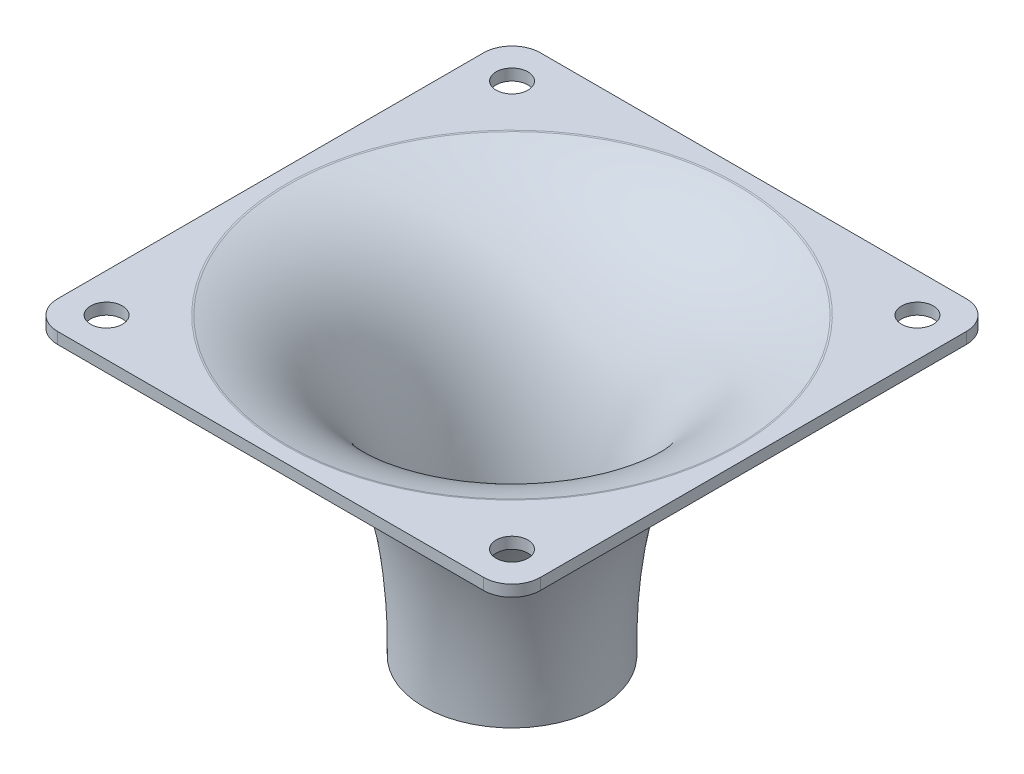
ISO-10303-21;
HEADER;
FILE_DESCRIPTION(('STEP AP214'),'2;1');
FILE_NAME('part.step','',(''),(''),'','','');
FILE_SCHEMA(('AUTOMOTIVE_DESIGN { 1 0 10303 214 1 1 1 1 }'));
ENDSEC;
DATA;
#1=APPLICATION_CONTEXT('core data for automotive mechanical design processes');
#2=APPLICATION_PROTOCOL_DEFINITION('international standard','automotive_design',2000,#1);
#3=PRODUCT_CONTEXT('',#1,'mechanical');
#4=PRODUCT('Part','Part','',(#3));
#5=PRODUCT_RELATED_PRODUCT_CATEGORY('part','',(#4));
#6=PRODUCT_DEFINITION_FORMATION('','',#4);
#7=PRODUCT_DEFINITION_CONTEXT('part definition',#1,'design');
#8=PRODUCT_DEFINITION('design','',#6,#7);
#9=PRODUCT_DEFINITION_SHAPE('','',#8);
#10=(LENGTH_UNIT() NAMED_UNIT(*) SI_UNIT(.MILLI.,.METRE.));
#11=(NAMED_UNIT(*) PLANE_ANGLE_UNIT() SI_UNIT($,.RADIAN.));
#12=(NAMED_UNIT(*) SI_UNIT($,.STERADIAN.) SOLID_ANGLE_UNIT());
#13=UNCERTAINTY_MEASURE_WITH_UNIT(LENGTH_MEASURE(1.E-05),#10,'distance_accuracy_value','');
#14=(GEOMETRIC_REPRESENTATION_CONTEXT(3) GLOBAL_UNCERTAINTY_ASSIGNED_CONTEXT((#13)) GLOBAL_UNIT_ASSIGNED_CONTEXT((#10,
#11,#12)) REPRESENTATION_CONTEXT('',''));
#15=CARTESIAN_POINT('',(0.,0.,0.));
#16=DIRECTION('',(0.,0.,1.));
#17=DIRECTION('',(1.,0.,0.));
#18=AXIS2_PLACEMENT_3D('',#15,#16,#17);
#19=CARTESIAN_POINT('',(42.5,1.,42.5));
#20=DIRECTION('',(0.,1.,0.));
#21=DIRECTION('',(0.,0.,1.));
#22=AXIS2_PLACEMENT_3D('',#19,#20,#21);
#23=TOROIDAL_SURFACE('',#22,39.8862733262738,1.);
#24=CARTESIAN_POINT('',(42.5,1.96300669732699,42.5));
#25=DIRECTION('',(0.,1.,0.));
#26=DIRECTION('',(0.,0.,1.));
#27=AXIS2_PLACEMENT_3D('',#24,#25,#26);
#28=CIRCLE('',#27,39.6167958672844);
#29=CARTESIAN_POINT('',(42.5,1.96300669732699,82.1167958672844));
#30=VERTEX_POINT('',#29);
#31=EDGE_CURVE('E40',#30,#30,#28,.T.);
#32=ORIENTED_EDGE('',*,*,#31,.F.);
#33=EDGE_LOOP('',(#32));
#34=FACE_BOUND('',#33,.T.);
#35=CARTESIAN_POINT('',(42.5,2.,42.5));
#36=DIRECTION('',(0.,-1.,0.));
#37=DIRECTION('',(0.,0.,-1.));
#38=AXIS2_PLACEMENT_3D('',#35,#36,#37);
#39=CIRCLE('',#38,39.8862733262738);
#40=CARTESIAN_POINT('',(42.5,2.,2.61372667372625));
#41=VERTEX_POINT('',#40);
#42=EDGE_CURVE('E11',#41,#41,#39,.T.);
#43=ORIENTED_EDGE('',*,*,#42,.F.);
#44=EDGE_LOOP('',(#43));
#45=FACE_BOUND('',#44,.T.);
#46=ADVANCED_FACE('F32',(#34,#45),#23,.T.);
#47=CARTESIAN_POINT('',(80.,2.,5.));
#48=DIRECTION('',(0.,-1.,0.));
#49=DIRECTION('',(0.,0.,-1.));
#50=AXIS2_PLACEMENT_3D('',#47,#48,#49);
#51=PLANE('',#50);
#52=ORIENTED_EDGE('',*,*,#42,.T.);
#53=EDGE_LOOP('',(#52));
#54=FACE_BOUND('',#53,.T.);
#55=CARTESIAN_POINT('',(80.,2.,5.));
#56=DIRECTION('',(0.,1.,0.));
#57=DIRECTION('',(0.,0.,-1.));
#58=AXIS2_PLACEMENT_3D('',#55,#56,#57);
#59=CIRCLE('',#58,5.);
#60=CARTESIAN_POINT('',(85.,2.,5.00000000000004));
#61=VERTEX_POINT('',#60);
#62=CARTESIAN_POINT('',(80.,2.,0.));
#63=VERTEX_POINT('',#62);
#64=EDGE_CURVE('E145',#61,#63,#59,.T.);
#65=ORIENTED_EDGE('',*,*,#64,.T.);
#66=DIRECTION('',(-1.,0.,0.));
#67=VECTOR('',#66,1.);
#68=CARTESIAN_POINT('',(5.00000000000004,2.,0.));
#69=LINE('',#68,#67);
#70=CARTESIAN_POINT('',(5.00000000000004,2.,0.));
#71=VERTEX_POINT('',#70);
#72=EDGE_CURVE('E92',#63,#71,#69,.T.);
#73=ORIENTED_EDGE('',*,*,#72,.T.);
#74=CARTESIAN_POINT('',(5.,2.,5.));
#75=DIRECTION('',(0.,1.,0.));
#76=DIRECTION('',(0.,0.,1.));
#77=AXIS2_PLACEMENT_3D('',#74,#75,#76);
#78=CIRCLE('',#77,5.);
#79=CARTESIAN_POINT('',(0.,2.,5.00000000000003));
#80=VERTEX_POINT('',#79);
#81=EDGE_CURVE('E219',#71,#80,#78,.T.);
#82=ORIENTED_EDGE('',*,*,#81,.T.);
#83=DIRECTION('',(0.,0.,1.));
#84=VECTOR('',#83,1.);
#85=CARTESIAN_POINT('',(0.,2.,5.00000000000004));
#86=LINE('',#85,#84);
#87=CARTESIAN_POINT('',(0.,2.,80.));
#88=VERTEX_POINT('',#87);
#89=EDGE_CURVE('E221',#80,#88,#86,.T.);
#90=ORIENTED_EDGE('',*,*,#89,.T.);
#91=CARTESIAN_POINT('',(5.,2.,80.));
#92=DIRECTION('',(0.,1.,0.));
#93=DIRECTION('',(0.,0.,1.));
#94=AXIS2_PLACEMENT_3D('',#91,#92,#93);
#95=CIRCLE('',#94,5.);
#96=CARTESIAN_POINT('',(5.,2.,85.));
#97=VERTEX_POINT('',#96);
#98=EDGE_CURVE('E112',#88,#97,#95,.T.);
#99=ORIENTED_EDGE('',*,*,#98,.T.);
#100=DIRECTION('',(1.,0.,0.));
#101=VECTOR('',#100,1.);
#102=CARTESIAN_POINT('',(5.00000000000004,2.,85.));
#103=LINE('',#102,#101);
#104=CARTESIAN_POINT('',(80.,2.,85.));
#105=VERTEX_POINT('',#104);
#106=EDGE_CURVE('E105',#97,#105,#103,.T.);
#107=ORIENTED_EDGE('',*,*,#106,.T.);
#108=CARTESIAN_POINT('',(80.,2.,80.));
#109=DIRECTION('',(0.,1.,0.));
#110=DIRECTION('',(0.,0.,1.));
#111=AXIS2_PLACEMENT_3D('',#108,#109,#110);
#112=CIRCLE('',#111,5.);
#113=CARTESIAN_POINT('',(85.,2.,80.));
#114=VERTEX_POINT('',#113);
#115=EDGE_CURVE('E110',#105,#114,#112,.T.);
#116=ORIENTED_EDGE('',*,*,#115,.T.);
#117=DIRECTION('',(0.,0.,-1.));
#118=VECTOR('',#117,1.);
#119=CARTESIAN_POINT('',(85.,2.,5.00000000000004));
#120=LINE('',#119,#118);
#121=EDGE_CURVE('E48',#114,#61,#120,.T.);
#122=ORIENTED_EDGE('',*,*,#121,.T.);
#123=EDGE_LOOP('',(#65,#73,#82,#90,#99,#107,#116,#122));
#124=FACE_BOUND('',#123,.T.);
#125=CARTESIAN_POINT('',(6.8,2.,6.8));
#126=DIRECTION('',(0.,1.,0.));
#127=DIRECTION('',(0.,0.,1.));
#128=AXIS2_PLACEMENT_3D('',#125,#126,#127);
#129=CIRCLE('',#128,2.8);
#130=CARTESIAN_POINT('',(6.8,2.,9.6));
#131=VERTEX_POINT('',#130);
#132=EDGE_CURVE('E134',#131,#131,#129,.T.);
#133=ORIENTED_EDGE('',*,*,#132,.F.);
#134=EDGE_LOOP('',(#133));
#135=FACE_BOUND('',#134,.T.);
#136=CARTESIAN_POINT('',(78.2,2.,6.8));
#137=DIRECTION('',(0.,1.,0.));
#138=DIRECTION('',(0.,0.,-1.));
#139=AXIS2_PLACEMENT_3D('',#136,#137,#138);
#140=CIRCLE('',#139,2.79999999999999);
#141=CARTESIAN_POINT('',(78.2,2.,4.00000000000001));
#142=VERTEX_POINT('',#141);
#143=EDGE_CURVE('E230',#142,#142,#140,.T.);
#144=ORIENTED_EDGE('',*,*,#143,.F.);
#145=EDGE_LOOP('',(#144));
#146=FACE_BOUND('',#145,.T.);
#147=CARTESIAN_POINT('',(78.2,2.,78.2));
#148=DIRECTION('',(0.,1.,0.));
#149=DIRECTION('',(0.,0.,1.));
#150=AXIS2_PLACEMENT_3D('',#147,#148,#149);
#151=CIRCLE('',#150,2.8);
#152=CARTESIAN_POINT('',(78.2,2.,81.));
#153=VERTEX_POINT('',#152);
#154=EDGE_CURVE('E236',#153,#153,#151,.T.);
#155=ORIENTED_EDGE('',*,*,#154,.F.);
#156=EDGE_LOOP('',(#155));
#157=FACE_BOUND('',#156,.T.);
#158=CARTESIAN_POINT('',(6.8,2.,78.2));
#159=DIRECTION('',(0.,1.,0.));
#160=DIRECTION('',(0.,0.,-1.));
#161=AXIS2_PLACEMENT_3D('',#158,#159,#160);
#162=CIRCLE('',#161,2.8);
#163=CARTESIAN_POINT('',(6.8,2.,75.4));
#164=VERTEX_POINT('',#163);
#165=EDGE_CURVE('E242',#164,#164,#162,.T.);
#166=ORIENTED_EDGE('',*,*,#165,.F.);
#167=EDGE_LOOP('',(#166));
#168=FACE_BOUND('',#167,.T.);
#169=ADVANCED_FACE('F107',(#54,#124,#135,#146,#157,#168),#51,.F.);
#170=CARTESIAN_POINT('',(80.,0.,5.));
#171=DIRECTION('',(0.,-1.,0.));
#172=DIRECTION('',(0.,0.,-1.));
#173=AXIS2_PLACEMENT_3D('',#170,#171,#172);
#174=PLANE('',#173);
#175=CARTESIAN_POINT('',(42.5,0.,42.5));
#176=DIRECTION('',(0.,1.,0.));
#177=DIRECTION('',(0.,0.,1.));
#178=AXIS2_PLACEMENT_3D('',#175,#176,#177);
#179=CIRCLE('',#178,40.0245836172002);
#180=CARTESIAN_POINT('',(42.5,0.,82.5245836172002));
#181=VERTEX_POINT('',#180);
#182=EDGE_CURVE('E160',#181,#181,#179,.F.);
#183=ORIENTED_EDGE('',*,*,#182,.F.);
#184=EDGE_LOOP('',(#183));
#185=FACE_BOUND('',#184,.T.);
#186=CARTESIAN_POINT('',(6.8,0.,78.2));
#187=DIRECTION('',(0.,1.,0.));
#188=DIRECTION('',(0.,0.,-1.));
#189=AXIS2_PLACEMENT_3D('',#186,#187,#188);
#190=CIRCLE('',#189,2.8);
#191=CARTESIAN_POINT('',(6.8,0.,75.4));
#192=VERTEX_POINT('',#191);
#193=EDGE_CURVE('E245',#192,#192,#190,.T.);
#194=ORIENTED_EDGE('',*,*,#193,.T.);
#195=EDGE_LOOP('',(#194));
#196=FACE_BOUND('',#195,.T.);
#197=CARTESIAN_POINT('',(78.2,0.,6.8));
#198=DIRECTION('',(0.,1.,0.));
#199=DIRECTION('',(0.,0.,-1.));
#200=AXIS2_PLACEMENT_3D('',#197,#198,#199);
#201=CIRCLE('',#200,2.79999999999999);
#202=CARTESIAN_POINT('',(78.2,0.,4.00000000000001));
#203=VERTEX_POINT('',#202);
#204=EDGE_CURVE('E233',#203,#203,#201,.T.);
#205=ORIENTED_EDGE('',*,*,#204,.T.);
#206=EDGE_LOOP('',(#205));
#207=FACE_BOUND('',#206,.T.);
#208=CARTESIAN_POINT('',(80.,0.,5.));
#209=DIRECTION('',(0.,1.,0.));
#210=DIRECTION('',(0.,0.,-1.));
#211=AXIS2_PLACEMENT_3D('',#208,#209,#210);
#212=CIRCLE('',#211,5.);
#213=CARTESIAN_POINT('',(85.,0.,5.00000000000004));
#214=VERTEX_POINT('',#213);
#215=CARTESIAN_POINT('',(80.,0.,0.));
#216=VERTEX_POINT('',#215);
#217=EDGE_CURVE('E130',#214,#216,#212,.T.);
#218=ORIENTED_EDGE('',*,*,#217,.F.);
#219=DIRECTION('',(0.,0.,-1.));
#220=VECTOR('',#219,1.);
#221=CARTESIAN_POINT('',(85.,0.,5.00000000000004));
#222=LINE('',#221,#220);
#223=CARTESIAN_POINT('',(85.,0.,80.));
#224=VERTEX_POINT('',#223);
#225=EDGE_CURVE('E83',#224,#214,#222,.T.);
#226=ORIENTED_EDGE('',*,*,#225,.F.);
#227=CARTESIAN_POINT('',(80.,0.,80.));
#228=DIRECTION('',(0.,1.,0.));
#229=DIRECTION('',(0.,0.,1.));
#230=AXIS2_PLACEMENT_3D('',#227,#228,#229);
#231=CIRCLE('',#230,5.);
#232=CARTESIAN_POINT('',(80.,0.,85.));
#233=VERTEX_POINT('',#232);
#234=EDGE_CURVE('E77',#233,#224,#231,.T.);
#235=ORIENTED_EDGE('',*,*,#234,.F.);
#236=DIRECTION('',(1.,0.,0.));
#237=VECTOR('',#236,1.);
#238=CARTESIAN_POINT('',(5.00000000000004,0.,85.));
#239=LINE('',#238,#237);
#240=CARTESIAN_POINT('',(5.,0.,85.));
#241=VERTEX_POINT('',#240);
#242=EDGE_CURVE('E120',#241,#233,#239,.T.);
#243=ORIENTED_EDGE('',*,*,#242,.F.);
#244=CARTESIAN_POINT('',(5.,0.,80.));
#245=DIRECTION('',(0.,1.,0.));
#246=DIRECTION('',(0.,0.,1.));
#247=AXIS2_PLACEMENT_3D('',#244,#245,#246);
#248=CIRCLE('',#247,5.);
#249=CARTESIAN_POINT('',(0.,0.,80.));
#250=VERTEX_POINT('',#249);
#251=EDGE_CURVE('E140',#250,#241,#248,.T.);
#252=ORIENTED_EDGE('',*,*,#251,.F.);
#253=DIRECTION('',(0.,0.,1.));
#254=VECTOR('',#253,1.);
#255=CARTESIAN_POINT('',(0.,0.,5.00000000000004));
#256=LINE('',#255,#254);
#257=CARTESIAN_POINT('',(0.,0.,5.00000000000003));
#258=VERTEX_POINT('',#257);
#259=EDGE_CURVE('E138',#258,#250,#256,.T.);
#260=ORIENTED_EDGE('',*,*,#259,.F.);
#261=CARTESIAN_POINT('',(5.,0.,5.));
#262=DIRECTION('',(0.,1.,0.));
#263=DIRECTION('',(0.,0.,1.));
#264=AXIS2_PLACEMENT_3D('',#261,#262,#263);
#265=CIRCLE('',#264,5.);
#266=CARTESIAN_POINT('',(5.00000000000004,0.,0.));
#267=VERTEX_POINT('',#266);
#268=EDGE_CURVE('E136',#267,#258,#265,.T.);
#269=ORIENTED_EDGE('',*,*,#268,.F.);
#270=DIRECTION('',(-1.,0.,0.));
#271=VECTOR('',#270,1.);
#272=CARTESIAN_POINT('',(5.00000000000004,0.,0.));
#273=LINE('',#272,#271);
#274=EDGE_CURVE('E133',#216,#267,#273,.T.);
#275=ORIENTED_EDGE('',*,*,#274,.F.);
#276=EDGE_LOOP('',(#218,#226,#235,#243,#252,#260,#269,#275));
#277=FACE_BOUND('',#276,.T.);
#278=CARTESIAN_POINT('',(6.8,0.,6.8));
#279=DIRECTION('',(0.,1.,0.));
#280=DIRECTION('',(0.,0.,1.));
#281=AXIS2_PLACEMENT_3D('',#278,#279,#280);
#282=CIRCLE('',#281,2.8);
#283=CARTESIAN_POINT('',(6.8,0.,9.6));
#284=VERTEX_POINT('',#283);
#285=EDGE_CURVE('E227',#284,#284,#282,.T.);
#286=ORIENTED_EDGE('',*,*,#285,.T.);
#287=EDGE_LOOP('',(#286));
#288=FACE_BOUND('',#287,.T.);
#289=CARTESIAN_POINT('',(78.2,0.,78.2));
#290=DIRECTION('',(0.,1.,0.));
#291=DIRECTION('',(0.,0.,1.));
#292=AXIS2_PLACEMENT_3D('',#289,#290,#291);
#293=CIRCLE('',#292,2.8);
#294=CARTESIAN_POINT('',(78.2,0.,81.));
#295=VERTEX_POINT('',#294);
#296=EDGE_CURVE('E239',#295,#295,#293,.T.);
#297=ORIENTED_EDGE('',*,*,#296,.T.);
#298=EDGE_LOOP('',(#297));
#299=FACE_BOUND('',#298,.T.);
#300=ADVANCED_FACE('F173',(#185,#196,#207,#277,#288,#299),#174,.T.);
#301=CARTESIAN_POINT('',(80.,2.,5.));
#302=DIRECTION('',(0.,-1.,0.));
#303=DIRECTION('',(0.,0.,-1.));
#304=AXIS2_PLACEMENT_3D('',#301,#302,#303);
#305=CYLINDRICAL_SURFACE('',#304,5.);
#306=ORIENTED_EDGE('',*,*,#217,.T.);
#307=DIRECTION('',(0.,-1.,0.));
#308=VECTOR('',#307,1.);
#309=CARTESIAN_POINT('',(80.,2.,0.));
#310=LINE('',#309,#308);
#311=EDGE_CURVE('E158',#63,#216,#310,.T.);
#312=ORIENTED_EDGE('',*,*,#311,.F.);
#313=ORIENTED_EDGE('',*,*,#64,.F.);
#314=DIRECTION('',(0.,-1.,0.));
#315=VECTOR('',#314,1.);
#316=CARTESIAN_POINT('',(85.,2.,5.00000000000004));
#317=LINE('',#316,#315);
#318=EDGE_CURVE('E126',#61,#214,#317,.T.);
#319=ORIENTED_EDGE('',*,*,#318,.T.);
#320=EDGE_LOOP('',(#306,#312,#313,#319));
#321=FACE_BOUND('',#320,.T.);
#322=ADVANCED_FACE('F178',(#321),#305,.T.);
#323=CARTESIAN_POINT('',(5.00000000000004,2.,0.));
#324=DIRECTION('',(0.,0.,1.));
#325=DIRECTION('',(1.,0.,0.));
#326=AXIS2_PLACEMENT_3D('',#323,#324,#325);
#327=PLANE('',#326);
#328=ORIENTED_EDGE('',*,*,#274,.T.);
#329=DIRECTION('',(0.,-1.,0.));
#330=VECTOR('',#329,1.);
#331=CARTESIAN_POINT('',(5.00000000000004,2.,0.));
#332=LINE('',#331,#330);
#333=EDGE_CURVE('E155',#71,#267,#332,.T.);
#334=ORIENTED_EDGE('',*,*,#333,.F.);
#335=ORIENTED_EDGE('',*,*,#72,.F.);
#336=ORIENTED_EDGE('',*,*,#311,.T.);
#337=EDGE_LOOP('',(#328,#334,#335,#336));
#338=FACE_BOUND('',#337,.T.);
#339=ADVANCED_FACE('F203',(#338),#327,.F.);
#340=CARTESIAN_POINT('',(5.,2.,5.));
#341=DIRECTION('',(0.,-1.,0.));
#342=DIRECTION('',(0.,0.,-1.));
#343=AXIS2_PLACEMENT_3D('',#340,#341,#342);
#344=CYLINDRICAL_SURFACE('',#343,5.);
#345=ORIENTED_EDGE('',*,*,#268,.T.);
#346=DIRECTION('',(0.,-1.,0.));
#347=VECTOR('',#346,1.);
#348=CARTESIAN_POINT('',(0.,2.,5.00000000000003));
#349=LINE('',#348,#347);
#350=EDGE_CURVE('E152',#80,#258,#349,.T.);
#351=ORIENTED_EDGE('',*,*,#350,.F.);
#352=ORIENTED_EDGE('',*,*,#81,.F.);
#353=ORIENTED_EDGE('',*,*,#333,.T.);
#354=EDGE_LOOP('',(#345,#351,#352,#353));
#355=FACE_BOUND('',#354,.T.);
#356=ADVANCED_FACE('F199',(#355),#344,.T.);
#357=CARTESIAN_POINT('',(0.,2.,5.00000000000004));
#358=DIRECTION('',(1.,0.,0.));
#359=DIRECTION('',(0.,0.,-1.));
#360=AXIS2_PLACEMENT_3D('',#357,#358,#359);
#361=PLANE('',#360);
#362=ORIENTED_EDGE('',*,*,#259,.T.);
#363=DIRECTION('',(0.,-1.,0.));
#364=VECTOR('',#363,1.);
#365=CARTESIAN_POINT('',(0.,2.,80.));
#366=LINE('',#365,#364);
#367=EDGE_CURVE('E149',#88,#250,#366,.T.);
#368=ORIENTED_EDGE('',*,*,#367,.F.);
#369=ORIENTED_EDGE('',*,*,#89,.F.);
#370=ORIENTED_EDGE('',*,*,#350,.T.);
#371=EDGE_LOOP('',(#362,#368,#369,#370));
#372=FACE_BOUND('',#371,.T.);
#373=ADVANCED_FACE('F195',(#372),#361,.F.);
#374=CARTESIAN_POINT('',(5.,2.,80.));
#375=DIRECTION('',(0.,-1.,0.));
#376=DIRECTION('',(0.,0.,-1.));
#377=AXIS2_PLACEMENT_3D('',#374,#375,#376);
#378=CYLINDRICAL_SURFACE('',#377,5.);
#379=ORIENTED_EDGE('',*,*,#251,.T.);
#380=DIRECTION('',(0.,-1.,0.));
#381=VECTOR('',#380,1.);
#382=CARTESIAN_POINT('',(5.,2.,85.));
#383=LINE('',#382,#381);
#384=EDGE_CURVE('E121',#97,#241,#383,.T.);
#385=ORIENTED_EDGE('',*,*,#384,.F.);
#386=ORIENTED_EDGE('',*,*,#98,.F.);
#387=ORIENTED_EDGE('',*,*,#367,.T.);
#388=EDGE_LOOP('',(#379,#385,#386,#387));
#389=FACE_BOUND('',#388,.T.);
#390=ADVANCED_FACE('F192',(#389),#378,.T.);
#391=CARTESIAN_POINT('',(5.00000000000004,2.,85.));
#392=DIRECTION('',(0.,0.,-1.));
#393=DIRECTION('',(-1.,0.,0.));
#394=AXIS2_PLACEMENT_3D('',#391,#392,#393);
#395=PLANE('',#394);
#396=ORIENTED_EDGE('',*,*,#242,.T.);
#397=DIRECTION('',(0.,-1.,0.));
#398=VECTOR('',#397,1.);
#399=CARTESIAN_POINT('',(80.,2.,85.));
#400=LINE('',#399,#398);
#401=EDGE_CURVE('E117',#105,#233,#400,.T.);
#402=ORIENTED_EDGE('',*,*,#401,.F.);
#403=ORIENTED_EDGE('',*,*,#106,.F.);
#404=ORIENTED_EDGE('',*,*,#384,.T.);
#405=EDGE_LOOP('',(#396,#402,#403,#404));
#406=FACE_BOUND('',#405,.T.);
#407=ADVANCED_FACE('F118',(#406),#395,.F.);
#408=CARTESIAN_POINT('',(80.,2.,80.));
#409=DIRECTION('',(0.,-1.,0.));
#410=DIRECTION('',(0.,0.,-1.));
#411=AXIS2_PLACEMENT_3D('',#408,#409,#410);
#412=CYLINDRICAL_SURFACE('',#411,5.);
#413=ORIENTED_EDGE('',*,*,#234,.T.);
#414=DIRECTION('',(0.,-1.,0.));
#415=VECTOR('',#414,1.);
#416=CARTESIAN_POINT('',(85.,2.,80.));
#417=LINE('',#416,#415);
#418=EDGE_CURVE('E122',#114,#224,#417,.T.);
#419=ORIENTED_EDGE('',*,*,#418,.F.);
#420=ORIENTED_EDGE('',*,*,#115,.F.);
#421=ORIENTED_EDGE('',*,*,#401,.T.);
#422=EDGE_LOOP('',(#413,#419,#420,#421));
#423=FACE_BOUND('',#422,.T.);
#424=ADVANCED_FACE('F124',(#423),#412,.T.);
#425=CARTESIAN_POINT('',(85.,2.,5.00000000000004));
#426=DIRECTION('',(-1.,0.,0.));
#427=DIRECTION('',(0.,0.,1.));
#428=AXIS2_PLACEMENT_3D('',#425,#426,#427);
#429=PLANE('',#428);
#430=ORIENTED_EDGE('',*,*,#225,.T.);
#431=ORIENTED_EDGE('',*,*,#318,.F.);
#432=ORIENTED_EDGE('',*,*,#121,.F.);
#433=ORIENTED_EDGE('',*,*,#418,.T.);
#434=EDGE_LOOP('',(#430,#431,#432,#433));
#435=FACE_BOUND('',#434,.T.);
#436=ADVANCED_FACE('F185',(#435),#429,.F.);
#437=CARTESIAN_POINT('',(6.8,2.,6.8));
#438=DIRECTION('',(0.,-1.,0.));
#439=DIRECTION('',(0.,0.,-1.));
#440=AXIS2_PLACEMENT_3D('',#437,#438,#439);
#441=CYLINDRICAL_SURFACE('',#440,2.8);
#442=ORIENTED_EDGE('',*,*,#132,.T.);
#443=EDGE_LOOP('',(#442));
#444=FACE_BOUND('',#443,.T.);
#445=ORIENTED_EDGE('',*,*,#285,.F.);
#446=EDGE_LOOP('',(#445));
#447=FACE_BOUND('',#446,.T.);
#448=ADVANCED_FACE('F182',(#444,#447),#441,.F.);
#449=CARTESIAN_POINT('',(78.2,2.,6.8));
#450=DIRECTION('',(0.,-1.,0.));
#451=DIRECTION('',(0.,0.,-1.));
#452=AXIS2_PLACEMENT_3D('',#449,#450,#451);
#453=CYLINDRICAL_SURFACE('',#452,2.79999999999999);
#454=ORIENTED_EDGE('',*,*,#143,.T.);
#455=EDGE_LOOP('',(#454));
#456=FACE_BOUND('',#455,.T.);
#457=ORIENTED_EDGE('',*,*,#204,.F.);
#458=EDGE_LOOP('',(#457));
#459=FACE_BOUND('',#458,.T.);
#460=ADVANCED_FACE('F281',(#456,#459),#453,.F.);
#461=CARTESIAN_POINT('',(78.2,2.,78.2));
#462=DIRECTION('',(0.,-1.,0.));
#463=DIRECTION('',(0.,0.,-1.));
#464=AXIS2_PLACEMENT_3D('',#461,#462,#463);
#465=CYLINDRICAL_SURFACE('',#464,2.8);
#466=ORIENTED_EDGE('',*,*,#154,.T.);
#467=EDGE_LOOP('',(#466));
#468=FACE_BOUND('',#467,.T.);
#469=ORIENTED_EDGE('',*,*,#296,.F.);
#470=EDGE_LOOP('',(#469));
#471=FACE_BOUND('',#470,.T.);
#472=ADVANCED_FACE('F278',(#468,#471),#465,.F.);
#473=CARTESIAN_POINT('',(6.8,2.,78.2));
#474=DIRECTION('',(0.,-1.,0.));
#475=DIRECTION('',(0.,0.,-1.));
#476=AXIS2_PLACEMENT_3D('',#473,#474,#475);
#477=CYLINDRICAL_SURFACE('',#476,2.8);
#478=ORIENTED_EDGE('',*,*,#165,.T.);
#479=EDGE_LOOP('',(#478));
#480=FACE_BOUND('',#479,.T.);
#481=ORIENTED_EDGE('',*,*,#193,.F.);
#482=EDGE_LOOP('',(#481));
#483=FACE_BOUND('',#482,.T.);
#484=ADVANCED_FACE('F275',(#480,#483),#477,.F.);
#485=CARTESIAN_POINT('',(42.5,2.,2.75));
#486=CARTESIAN_POINT('',(42.5,-5.34480347397448,29.3988898958726));
#487=CARTESIAN_POINT('',(42.5,-50.,28.9584496705481));
#488=B_SPLINE_CURVE_WITH_KNOTS('',2,(#485,#486,#487),.UNSPECIFIED.,.F.,.F.,(3,3),(0.,1.),.UNSPECIFIED.);
#489=CARTESIAN_POINT('',(42.5,0.,42.5));
#490=DIRECTION('',(0.,1.,0.));
#491=AXIS1_PLACEMENT('',#489,#490);
#492=SURFACE_OF_REVOLUTION('',#488,#491);
#493=ORIENTED_EDGE('',*,*,#31,.T.);
#494=EDGE_LOOP('',(#493));
#495=FACE_BOUND('',#494,.T.);
#496=CARTESIAN_POINT('',(42.5,-50.,42.5));
#497=DIRECTION('',(0.,1.,0.));
#498=DIRECTION('',(0.,0.,1.));
#499=AXIS2_PLACEMENT_3D('',#496,#497,#498);
#500=CIRCLE('',#499,13.5415503294519);
#501=CARTESIAN_POINT('',(42.5,-50.,56.0415503294519));
#502=VERTEX_POINT('',#501);
#503=EDGE_CURVE('E253',#502,#502,#500,.T.);
#504=ORIENTED_EDGE('',*,*,#503,.F.);
#505=EDGE_LOOP('',(#504));
#506=FACE_BOUND('',#505,.T.);
#507=ADVANCED_FACE('F165',(#495,#506),#492,.T.);
#508=CARTESIAN_POINT('',(42.5,0.071892132010397,2.21858674329992));
#509=CARTESIAN_POINT('',(42.5,-0.505597157833753,4.31387064785002));
#510=CARTESIAN_POINT('',(42.5,-1.26218900571989,6.26190578174051));
#511=CARTESIAN_POINT('',(42.5,-3.13051837524687,9.8811803303572));
#512=CARTESIAN_POINT('',(42.5,-4.24219810378194,11.5528724768131));
#513=CARTESIAN_POINT('',(42.5,-6.83103852449084,14.6392445511123));
#514=CARTESIAN_POINT('',(42.5,-8.30860637250975,16.0542041392322));
#515=CARTESIAN_POINT('',(42.5,-11.6482458600792,18.6353553771624));
#516=CARTESIAN_POINT('',(42.5,-13.5106325199559,19.8013507331596));
#517=CARTESIAN_POINT('',(42.5,-19.6963904787977,22.9190262358231));
#518=CARTESIAN_POINT('',(42.5,-24.6211808208457,24.4888798907002));
#519=CARTESIAN_POINT('',(42.5,-36.0931107334537,26.5450350868745));
#520=CARTESIAN_POINT('',(42.5,-42.637459459886,27.0309701217092));
#521=CARTESIAN_POINT('',(42.5,-49.9802746897193,26.95854694488));
#522=B_SPLINE_CURVE_WITH_KNOTS('',3,(#508,#509,#510,#511,#512,#513,#514,#515,#516,#517,#518,
#519,#520,#521),.UNSPECIFIED.,.F.,.F.,(4,2,2,2,2,2,4),(0.,0.125,0.25,0.375,0.5,0.75,1.),.UNSPECIFIED.);
#523=CARTESIAN_POINT('',(42.5,0.,42.5));
#524=DIRECTION('',(0.,1.,0.));
#525=AXIS1_PLACEMENT('',#523,#524);
#526=SURFACE_OF_REVOLUTION('',#522,#525);
#527=ORIENTED_EDGE('',*,*,#182,.T.);
#528=EDGE_LOOP('',(#527));
#529=FACE_BOUND('',#528,.T.);
#530=CARTESIAN_POINT('',(42.5,-49.9802746897193,42.5));
#531=DIRECTION('',(0.,1.,0.));
#532=DIRECTION('',(0.,0.,1.));
#533=AXIS2_PLACEMENT_3D('',#530,#531,#532);
#534=CIRCLE('',#533,15.54145305512);
#535=CARTESIAN_POINT('',(42.5,-49.9802746897193,58.04145305512));
#536=VERTEX_POINT('',#535);
#537=EDGE_CURVE('E248',#536,#536,#534,.T.);
#538=ORIENTED_EDGE('',*,*,#537,.T.);
#539=EDGE_LOOP('',(#538));
#540=FACE_BOUND('',#539,.T.);
#541=ADVANCED_FACE('F267',(#529,#540),#526,.F.);
#542=CARTESIAN_POINT('',(42.5,-49.9802746897193,42.5));
#543=DIRECTION('',(0.,1.,0.));
#544=DIRECTION('',(0.,0.,1.));
#545=AXIS2_PLACEMENT_3D('',#542,#543,#544);
#546=CONICAL_SURFACE('',#545,15.54145305512,1.56093351175425);
#547=ORIENTED_EDGE('',*,*,#503,.T.);
#548=EDGE_LOOP('',(#547));
#549=FACE_BOUND('',#548,.T.);
#550=ORIENTED_EDGE('',*,*,#537,.F.);
#551=EDGE_LOOP('',(#550));
#552=FACE_BOUND('',#551,.T.);
#553=ADVANCED_FACE('F271',(#549,#552),#546,.T.);
#554=CLOSED_SHELL('',(#46,#169,#300,#322,#339,#356,#373,#390,#407,#424,#436,#448,#460,#472,#484,
#507,#541,#553));
#555=MANIFOLD_SOLID_BREP('B2',#554);
#556=ADVANCED_BREP_SHAPE_REPRESENTATION('',(#18,#555),#14);
#557=SHAPE_DEFINITION_REPRESENTATION(#9,#556);
ENDSEC;
END-ISO-10303-21;
